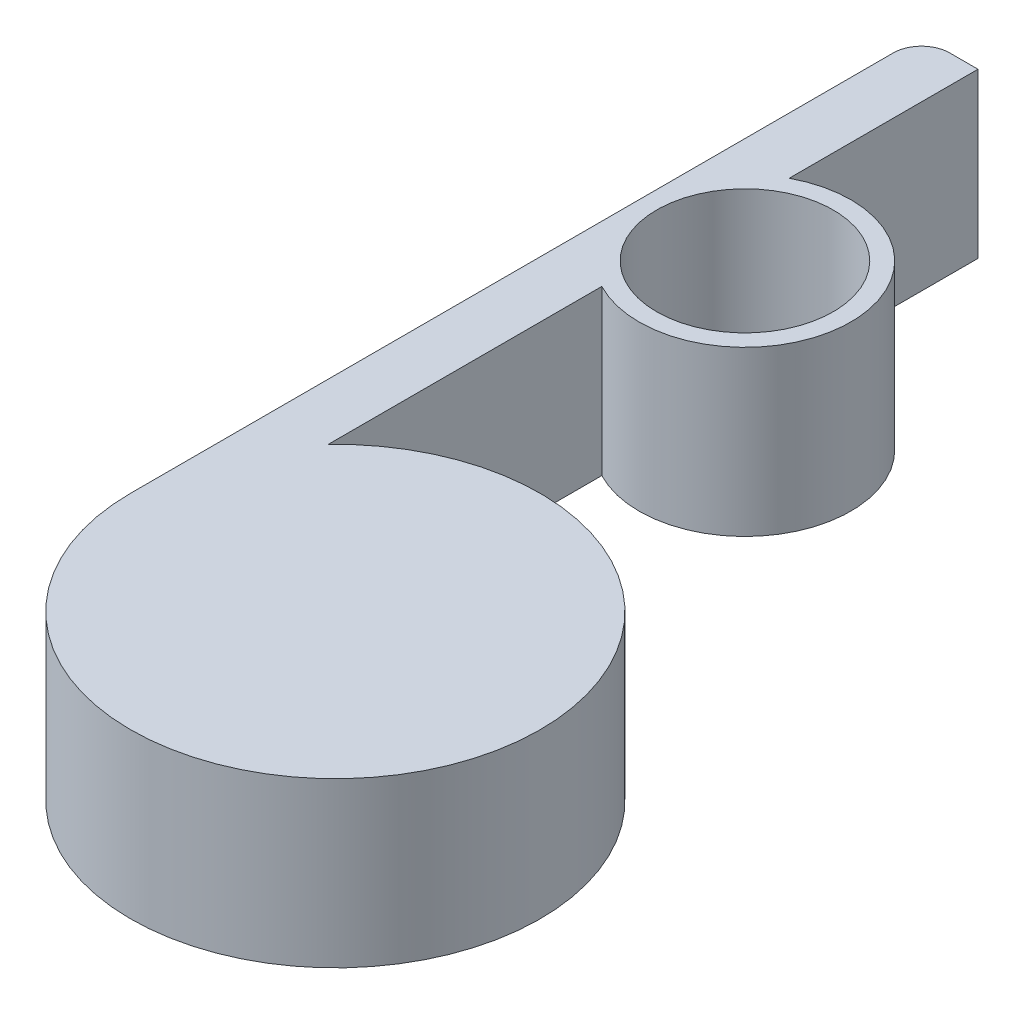
ISO-10303-21;
HEADER;
FILE_DESCRIPTION(('STEP AP214'),'2;1');
FILE_NAME('part.step','',(''),(''),'','','');
FILE_SCHEMA(('AUTOMOTIVE_DESIGN { 1 0 10303 214 1 1 1 1 }'));
ENDSEC;
DATA;
#1=APPLICATION_CONTEXT('core data for automotive mechanical design processes');
#2=APPLICATION_PROTOCOL_DEFINITION('international standard','automotive_design',2000,#1);
#3=PRODUCT_CONTEXT('',#1,'mechanical');
#4=PRODUCT('Part','Part','',(#3));
#5=PRODUCT_RELATED_PRODUCT_CATEGORY('part','',(#4));
#6=PRODUCT_DEFINITION_FORMATION('','',#4);
#7=PRODUCT_DEFINITION_CONTEXT('part definition',#1,'design');
#8=PRODUCT_DEFINITION('design','',#6,#7);
#9=PRODUCT_DEFINITION_SHAPE('','',#8);
#10=(LENGTH_UNIT() NAMED_UNIT(*) SI_UNIT(.MILLI.,.METRE.));
#11=(NAMED_UNIT(*) PLANE_ANGLE_UNIT() SI_UNIT($,.RADIAN.));
#12=(NAMED_UNIT(*) SI_UNIT($,.STERADIAN.) SOLID_ANGLE_UNIT());
#13=UNCERTAINTY_MEASURE_WITH_UNIT(LENGTH_MEASURE(1.E-05),#10,'distance_accuracy_value','');
#14=(GEOMETRIC_REPRESENTATION_CONTEXT(3) GLOBAL_UNCERTAINTY_ASSIGNED_CONTEXT((#13)) GLOBAL_UNIT_ASSIGNED_CONTEXT((#10,
#11,#12)) REPRESENTATION_CONTEXT('',''));
#15=CARTESIAN_POINT('',(0.,0.,0.));
#16=DIRECTION('',(0.,0.,1.));
#17=DIRECTION('',(1.,0.,0.));
#18=AXIS2_PLACEMENT_3D('',#15,#16,#17);
#19=CARTESIAN_POINT('',(3.5,5.8,18.));
#20=DIRECTION('',(0.,-1.,0.));
#21=DIRECTION('',(0.,0.,-1.));
#22=AXIS2_PLACEMENT_3D('',#19,#20,#21);
#23=CYLINDRICAL_SURFACE('',#22,7.25);
#24=CARTESIAN_POINT('',(3.5,0.,18.));
#25=DIRECTION('',(0.,1.,0.));
#26=DIRECTION('',(0.,0.,1.));
#27=AXIS2_PLACEMENT_3D('',#24,#25,#26);
#28=CIRCLE('',#27,7.25);
#29=CARTESIAN_POINT('',(-3.75,0.,18.));
#30=VERTEX_POINT('',#29);
#31=CARTESIAN_POINT('',(-1.75,0.,13.));
#32=VERTEX_POINT('',#31);
#33=EDGE_CURVE('E115',#30,#32,#28,.T.);
#34=ORIENTED_EDGE('',*,*,#33,.T.);
#35=DIRECTION('',(0.,-1.,0.));
#36=VECTOR('',#35,1.);
#37=CARTESIAN_POINT('',(-1.75,5.8,13.));
#38=LINE('',#37,#36);
#39=CARTESIAN_POINT('',(-1.75,5.8,13.));
#40=VERTEX_POINT('',#39);
#41=EDGE_CURVE('E96',#40,#32,#38,.T.);
#42=ORIENTED_EDGE('',*,*,#41,.F.);
#43=CARTESIAN_POINT('',(3.5,5.8,18.));
#44=DIRECTION('',(0.,1.,0.));
#45=DIRECTION('',(0.,0.,1.));
#46=AXIS2_PLACEMENT_3D('',#43,#44,#45);
#47=CIRCLE('',#46,7.25);
#48=CARTESIAN_POINT('',(-3.75,5.8,18.));
#49=VERTEX_POINT('',#48);
#50=EDGE_CURVE('E103',#49,#40,#47,.T.);
#51=ORIENTED_EDGE('',*,*,#50,.F.);
#52=DIRECTION('',(0.,-1.,0.));
#53=VECTOR('',#52,1.);
#54=CARTESIAN_POINT('',(-3.75,5.8,18.));
#55=LINE('',#54,#53);
#56=EDGE_CURVE('E128',#49,#30,#55,.T.);
#57=ORIENTED_EDGE('',*,*,#56,.T.);
#58=EDGE_LOOP('',(#34,#42,#51,#57));
#59=FACE_BOUND('',#58,.T.);
#60=ADVANCED_FACE('F35',(#59),#23,.T.);
#61=CARTESIAN_POINT('',(-1.75,5.8,0.));
#62=DIRECTION('',(-1.,0.,0.));
#63=DIRECTION('',(0.,0.,1.));
#64=AXIS2_PLACEMENT_3D('',#61,#62,#63);
#65=PLANE('',#64);
#66=DIRECTION('',(0.,0.,-1.));
#67=VECTOR('',#66,1.);
#68=CARTESIAN_POINT('',(-1.75,0.,0.));
#69=LINE('',#68,#67);
#70=CARTESIAN_POINT('',(-1.75,0.,3.3166247903554));
#71=VERTEX_POINT('',#70);
#72=EDGE_CURVE('E143',#32,#71,#69,.T.);
#73=ORIENTED_EDGE('',*,*,#72,.T.);
#74=DIRECTION('',(0.,-1.,0.));
#75=VECTOR('',#74,1.);
#76=CARTESIAN_POINT('',(-1.75,5.8,3.3166247903554));
#77=LINE('',#76,#75);
#78=CARTESIAN_POINT('',(-1.75,5.8,3.3166247903554));
#79=VERTEX_POINT('',#78);
#80=EDGE_CURVE('E99',#79,#71,#77,.T.);
#81=ORIENTED_EDGE('',*,*,#80,.F.);
#82=DIRECTION('',(0.,0.,-1.));
#83=VECTOR('',#82,1.);
#84=CARTESIAN_POINT('',(-1.75,5.8,0.));
#85=LINE('',#84,#83);
#86=EDGE_CURVE('E92',#40,#79,#85,.T.);
#87=ORIENTED_EDGE('',*,*,#86,.F.);
#88=ORIENTED_EDGE('',*,*,#41,.T.);
#89=EDGE_LOOP('',(#73,#81,#87,#88));
#90=FACE_BOUND('',#89,.T.);
#91=ADVANCED_FACE('F94',(#90),#65,.F.);
#92=CARTESIAN_POINT('',(0.,5.8,0.));
#93=DIRECTION('',(0.,-1.,0.));
#94=DIRECTION('',(0.,0.,-1.));
#95=AXIS2_PLACEMENT_3D('',#92,#93,#94);
#96=CYLINDRICAL_SURFACE('',#95,3.75);
#97=CARTESIAN_POINT('',(0.,0.,0.));
#98=DIRECTION('',(0.,1.,0.));
#99=DIRECTION('',(0.,0.,1.));
#100=AXIS2_PLACEMENT_3D('',#97,#98,#99);
#101=CIRCLE('',#100,3.75);
#102=CARTESIAN_POINT('',(-1.75,0.,-3.3166247903554));
#103=VERTEX_POINT('',#102);
#104=EDGE_CURVE('E140',#71,#103,#101,.T.);
#105=ORIENTED_EDGE('',*,*,#104,.T.);
#106=DIRECTION('',(0.,-1.,0.));
#107=VECTOR('',#106,1.);
#108=CARTESIAN_POINT('',(-1.75,5.8,-3.3166247903554));
#109=LINE('',#108,#107);
#110=CARTESIAN_POINT('',(-1.75,5.8,-3.3166247903554));
#111=VERTEX_POINT('',#110);
#112=EDGE_CURVE('E120',#111,#103,#109,.T.);
#113=ORIENTED_EDGE('',*,*,#112,.F.);
#114=CARTESIAN_POINT('',(0.,5.8,0.));
#115=DIRECTION('',(0.,1.,0.));
#116=DIRECTION('',(0.,0.,1.));
#117=AXIS2_PLACEMENT_3D('',#114,#115,#116);
#118=CIRCLE('',#117,3.75);
#119=EDGE_CURVE('E102',#79,#111,#118,.T.);
#120=ORIENTED_EDGE('',*,*,#119,.F.);
#121=ORIENTED_EDGE('',*,*,#80,.T.);
#122=EDGE_LOOP('',(#105,#113,#120,#121));
#123=FACE_BOUND('',#122,.T.);
#124=ADVANCED_FACE('F157',(#123),#96,.T.);
#125=CARTESIAN_POINT('',(-1.75,5.8,0.));
#126=DIRECTION('',(1.,0.,0.));
#127=DIRECTION('',(0.,0.,-1.));
#128=AXIS2_PLACEMENT_3D('',#125,#126,#127);
#129=PLANE('',#128);
#130=DIRECTION('',(0.,0.,1.));
#131=VECTOR('',#130,1.);
#132=CARTESIAN_POINT('',(-1.75,0.,0.));
#133=LINE('',#132,#131);
#134=CARTESIAN_POINT('',(-1.75,0.,-10.));
#135=VERTEX_POINT('',#134);
#136=EDGE_CURVE('E137',#135,#103,#133,.T.);
#137=ORIENTED_EDGE('',*,*,#136,.F.);
#138=DIRECTION('',(0.,-1.,0.));
#139=VECTOR('',#138,1.);
#140=CARTESIAN_POINT('',(-1.75,5.8,-10.));
#141=LINE('',#140,#139);
#142=CARTESIAN_POINT('',(-1.75,5.8,-10.));
#143=VERTEX_POINT('',#142);
#144=EDGE_CURVE('E125',#143,#135,#141,.T.);
#145=ORIENTED_EDGE('',*,*,#144,.F.);
#146=DIRECTION('',(0.,0.,1.));
#147=VECTOR('',#146,1.);
#148=CARTESIAN_POINT('',(-1.75,5.8,0.));
#149=LINE('',#148,#147);
#150=EDGE_CURVE('E151',#143,#111,#149,.T.);
#151=ORIENTED_EDGE('',*,*,#150,.T.);
#152=ORIENTED_EDGE('',*,*,#112,.T.);
#153=EDGE_LOOP('',(#137,#145,#151,#152));
#154=FACE_BOUND('',#153,.T.);
#155=ADVANCED_FACE('F162',(#154),#129,.T.);
#156=CARTESIAN_POINT('',(0.,5.8,-10.));
#157=DIRECTION('',(0.,0.,-1.));
#158=DIRECTION('',(-1.,0.,0.));
#159=AXIS2_PLACEMENT_3D('',#156,#157,#158);
#160=PLANE('',#159);
#161=DIRECTION('',(1.,0.,0.));
#162=VECTOR('',#161,1.);
#163=CARTESIAN_POINT('',(0.,0.,-10.));
#164=LINE('',#163,#162);
#165=CARTESIAN_POINT('',(-2.75,0.,-10.));
#166=VERTEX_POINT('',#165);
#167=EDGE_CURVE('E135',#166,#135,#164,.T.);
#168=ORIENTED_EDGE('',*,*,#167,.F.);
#169=DIRECTION('',(0.,-1.,0.));
#170=VECTOR('',#169,1.);
#171=CARTESIAN_POINT('',(-2.75,5.8,-10.));
#172=LINE('',#171,#170);
#173=CARTESIAN_POINT('',(-2.75,5.8,-10.));
#174=VERTEX_POINT('',#173);
#175=EDGE_CURVE('E43',#166,#174,#172,.F.);
#176=ORIENTED_EDGE('',*,*,#175,.T.);
#177=DIRECTION('',(1.,0.,0.));
#178=VECTOR('',#177,1.);
#179=CARTESIAN_POINT('',(0.,5.8,-10.));
#180=LINE('',#179,#178);
#181=EDGE_CURVE('E149',#174,#143,#180,.T.);
#182=ORIENTED_EDGE('',*,*,#181,.T.);
#183=ORIENTED_EDGE('',*,*,#144,.T.);
#184=EDGE_LOOP('',(#168,#176,#182,#183));
#185=FACE_BOUND('',#184,.T.);
#186=ADVANCED_FACE('F163',(#185),#160,.T.);
#187=CARTESIAN_POINT('',(-3.75,5.8,0.));
#188=DIRECTION('',(-1.,0.,0.));
#189=DIRECTION('',(0.,0.,1.));
#190=AXIS2_PLACEMENT_3D('',#187,#188,#189);
#191=PLANE('',#190);
#192=DIRECTION('',(0.,0.,-1.));
#193=VECTOR('',#192,1.);
#194=CARTESIAN_POINT('',(-3.75,5.8,0.));
#195=LINE('',#194,#193);
#196=CARTESIAN_POINT('',(-3.75,5.8,-9.));
#197=VERTEX_POINT('',#196);
#198=EDGE_CURVE('E110',#49,#197,#195,.T.);
#199=ORIENTED_EDGE('',*,*,#198,.T.);
#200=DIRECTION('',(0.,-1.,0.));
#201=VECTOR('',#200,1.);
#202=CARTESIAN_POINT('',(-3.75,5.8,-9.));
#203=LINE('',#202,#201);
#204=CARTESIAN_POINT('',(-3.75,0.,-9.));
#205=VERTEX_POINT('',#204);
#206=EDGE_CURVE('E116',#197,#205,#203,.T.);
#207=ORIENTED_EDGE('',*,*,#206,.T.);
#208=DIRECTION('',(0.,0.,-1.));
#209=VECTOR('',#208,1.);
#210=CARTESIAN_POINT('',(-3.75,0.,0.));
#211=LINE('',#210,#209);
#212=EDGE_CURVE('E133',#30,#205,#211,.T.);
#213=ORIENTED_EDGE('',*,*,#212,.F.);
#214=ORIENTED_EDGE('',*,*,#56,.F.);
#215=EDGE_LOOP('',(#199,#207,#213,#214));
#216=FACE_BOUND('',#215,.T.);
#217=ADVANCED_FACE('F169',(#216),#191,.T.);
#218=CARTESIAN_POINT('',(0.,5.8,0.));
#219=DIRECTION('',(0.,-1.,0.));
#220=DIRECTION('',(0.,0.,-1.));
#221=AXIS2_PLACEMENT_3D('',#218,#219,#220);
#222=CYLINDRICAL_SURFACE('',#221,3.125);
#223=CARTESIAN_POINT('',(0.,5.8,0.));
#224=DIRECTION('',(0.,1.,0.));
#225=DIRECTION('',(0.,0.,1.));
#226=AXIS2_PLACEMENT_3D('',#223,#224,#225);
#227=CIRCLE('',#226,3.125);
#228=CARTESIAN_POINT('',(0.,5.8,3.125));
#229=VERTEX_POINT('',#228);
#230=EDGE_CURVE('E130',#229,#229,#227,.T.);
#231=ORIENTED_EDGE('',*,*,#230,.T.);
#232=EDGE_LOOP('',(#231));
#233=FACE_BOUND('',#232,.T.);
#234=CARTESIAN_POINT('',(0.,0.,0.));
#235=DIRECTION('',(0.,1.,0.));
#236=DIRECTION('',(0.,0.,1.));
#237=AXIS2_PLACEMENT_3D('',#234,#235,#236);
#238=CIRCLE('',#237,3.125);
#239=CARTESIAN_POINT('',(0.,0.,3.125));
#240=VERTEX_POINT('',#239);
#241=EDGE_CURVE('E112',#240,#240,#238,.T.);
#242=ORIENTED_EDGE('',*,*,#241,.F.);
#243=EDGE_LOOP('',(#242));
#244=FACE_BOUND('',#243,.T.);
#245=ADVANCED_FACE('F176',(#233,#244),#222,.F.);
#246=CARTESIAN_POINT('',(0.,5.8,0.));
#247=DIRECTION('',(0.,1.,0.));
#248=DIRECTION('',(0.,0.,1.));
#249=AXIS2_PLACEMENT_3D('',#246,#247,#248);
#250=PLANE('',#249);
#251=ORIENTED_EDGE('',*,*,#181,.F.);
#252=CARTESIAN_POINT('',(-2.75,5.8,-9.));
#253=DIRECTION('',(0.,1.,0.));
#254=DIRECTION('',(0.,0.,1.));
#255=AXIS2_PLACEMENT_3D('',#252,#253,#254);
#256=CIRCLE('',#255,1.);
#257=EDGE_CURVE('E11',#174,#197,#256,.T.);
#258=ORIENTED_EDGE('',*,*,#257,.T.);
#259=ORIENTED_EDGE('',*,*,#198,.F.);
#260=ORIENTED_EDGE('',*,*,#50,.T.);
#261=ORIENTED_EDGE('',*,*,#86,.T.);
#262=ORIENTED_EDGE('',*,*,#119,.T.);
#263=ORIENTED_EDGE('',*,*,#150,.F.);
#264=EDGE_LOOP('',(#251,#258,#259,#260,#261,#262,#263));
#265=FACE_BOUND('',#264,.T.);
#266=ORIENTED_EDGE('',*,*,#230,.F.);
#267=EDGE_LOOP('',(#266));
#268=FACE_BOUND('',#267,.T.);
#269=ADVANCED_FACE('F107',(#265,#268),#250,.T.);
#270=CARTESIAN_POINT('',(0.,0.,0.));
#271=DIRECTION('',(0.,1.,0.));
#272=DIRECTION('',(0.,0.,1.));
#273=AXIS2_PLACEMENT_3D('',#270,#271,#272);
#274=PLANE('',#273);
#275=ORIENTED_EDGE('',*,*,#212,.T.);
#276=CARTESIAN_POINT('',(-2.75,0.,-9.));
#277=DIRECTION('',(0.,1.,0.));
#278=DIRECTION('',(0.,0.,1.));
#279=AXIS2_PLACEMENT_3D('',#276,#277,#278);
#280=CIRCLE('',#279,1.);
#281=EDGE_CURVE('E57',#205,#166,#280,.F.);
#282=ORIENTED_EDGE('',*,*,#281,.T.);
#283=ORIENTED_EDGE('',*,*,#167,.T.);
#284=ORIENTED_EDGE('',*,*,#136,.T.);
#285=ORIENTED_EDGE('',*,*,#104,.F.);
#286=ORIENTED_EDGE('',*,*,#72,.F.);
#287=ORIENTED_EDGE('',*,*,#33,.F.);
#288=EDGE_LOOP('',(#275,#282,#283,#284,#285,#286,#287));
#289=FACE_BOUND('',#288,.T.);
#290=ORIENTED_EDGE('',*,*,#241,.T.);
#291=EDGE_LOOP('',(#290));
#292=FACE_BOUND('',#291,.T.);
#293=ADVANCED_FACE('F170',(#289,#292),#274,.F.);
#294=CARTESIAN_POINT('',(-2.75,5.8,-9.));
#295=DIRECTION('',(0.,-1.,0.));
#296=DIRECTION('',(0.,0.,-1.));
#297=AXIS2_PLACEMENT_3D('',#294,#295,#296);
#298=CYLINDRICAL_SURFACE('',#297,1.);
#299=ORIENTED_EDGE('',*,*,#257,.F.);
#300=ORIENTED_EDGE('',*,*,#175,.F.);
#301=ORIENTED_EDGE('',*,*,#281,.F.);
#302=ORIENTED_EDGE('',*,*,#206,.F.);
#303=EDGE_LOOP('',(#299,#300,#301,#302));
#304=FACE_BOUND('',#303,.T.);
#305=ADVANCED_FACE('F37',(#304),#298,.T.);
#306=CLOSED_SHELL('',(#60,#91,#124,#155,#186,#217,#245,#269,#293,#305));
#307=MANIFOLD_SOLID_BREP('B2',#306);
#308=ADVANCED_BREP_SHAPE_REPRESENTATION('',(#18,#307),#14);
#309=SHAPE_DEFINITION_REPRESENTATION(#9,#308);
ENDSEC;
END-ISO-10303-21;
